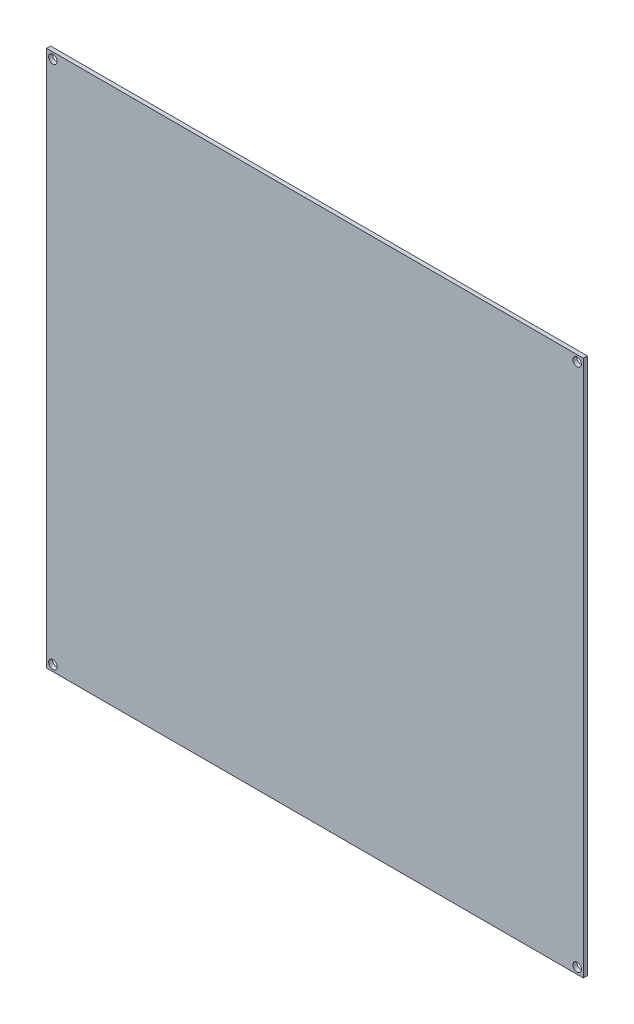
ISO-10303-21;
HEADER;
FILE_DESCRIPTION(('STEP AP214'),'2;1');
FILE_NAME('part.step','',(''),(''),'','','');
FILE_SCHEMA(('AUTOMOTIVE_DESIGN { 1 0 10303 214 1 1 1 1 }'));
ENDSEC;
DATA;
#1=APPLICATION_CONTEXT('core data for automotive mechanical design processes');
#2=APPLICATION_PROTOCOL_DEFINITION('international standard','automotive_design',2000,#1);
#3=PRODUCT_CONTEXT('',#1,'mechanical');
#4=PRODUCT('Part','Part','',(#3));
#5=PRODUCT_RELATED_PRODUCT_CATEGORY('part','',(#4));
#6=PRODUCT_DEFINITION_FORMATION('','',#4);
#7=PRODUCT_DEFINITION_CONTEXT('part definition',#1,'design');
#8=PRODUCT_DEFINITION('design','',#6,#7);
#9=PRODUCT_DEFINITION_SHAPE('','',#8);
#10=(LENGTH_UNIT() NAMED_UNIT(*) SI_UNIT(.MILLI.,.METRE.));
#11=(NAMED_UNIT(*) PLANE_ANGLE_UNIT() SI_UNIT($,.RADIAN.));
#12=(NAMED_UNIT(*) SI_UNIT($,.STERADIAN.) SOLID_ANGLE_UNIT());
#13=UNCERTAINTY_MEASURE_WITH_UNIT(LENGTH_MEASURE(1.E-05),#10,'distance_accuracy_value','');
#14=(GEOMETRIC_REPRESENTATION_CONTEXT(3) GLOBAL_UNCERTAINTY_ASSIGNED_CONTEXT((#13)) GLOBAL_UNIT_ASSIGNED_CONTEXT((#10,
#11,#12)) REPRESENTATION_CONTEXT('',''));
#15=CARTESIAN_POINT('',(0.,0.,0.));
#16=DIRECTION('',(0.,0.,1.));
#17=DIRECTION('',(1.,0.,0.));
#18=AXIS2_PLACEMENT_3D('',#15,#16,#17);
#19=CARTESIAN_POINT('',(-57.,11.,0.800000011920929));
#20=DIRECTION('',(-1.,0.,0.));
#21=DIRECTION('',(0.,0.,1.));
#22=AXIS2_PLACEMENT_3D('',#19,#20,#21);
#23=PLANE('',#22);
#24=DIRECTION('',(0.,1.,0.));
#25=VECTOR('',#24,1.);
#26=CARTESIAN_POINT('',(-57.,11.,-0.800000011920929));
#27=LINE('',#26,#25);
#28=CARTESIAN_POINT('',(-57.,11.,-0.800000011920929));
#29=VERTEX_POINT('',#28);
#30=CARTESIAN_POINT('',(-57.,225.,-0.800000011920929));
#31=VERTEX_POINT('',#30);
#32=EDGE_CURVE('E99',#29,#31,#27,.T.);
#33=ORIENTED_EDGE('',*,*,#32,.F.);
#34=DIRECTION('',(0.,0.,-1.));
#35=VECTOR('',#34,1.);
#36=CARTESIAN_POINT('',(-57.,11.,0.800000011920929));
#37=LINE('',#36,#35);
#38=CARTESIAN_POINT('',(-57.,11.,0.800000011920929));
#39=VERTEX_POINT('',#38);
#40=EDGE_CURVE('E11',#39,#29,#37,.T.);
#41=ORIENTED_EDGE('',*,*,#40,.F.);
#42=DIRECTION('',(0.,1.,0.));
#43=VECTOR('',#42,1.);
#44=CARTESIAN_POINT('',(-57.,11.,0.800000011920929));
#45=LINE('',#44,#43);
#46=CARTESIAN_POINT('',(-57.,225.,0.800000011920929));
#47=VERTEX_POINT('',#46);
#48=EDGE_CURVE('E92',#39,#47,#45,.T.);
#49=ORIENTED_EDGE('',*,*,#48,.T.);
#50=DIRECTION('',(0.,0.,-1.));
#51=VECTOR('',#50,1.);
#52=CARTESIAN_POINT('',(-57.,225.,0.800000011920929));
#53=LINE('',#52,#51);
#54=EDGE_CURVE('E37',#47,#31,#53,.T.);
#55=ORIENTED_EDGE('',*,*,#54,.T.);
#56=EDGE_LOOP('',(#33,#41,#49,#55));
#57=FACE_BOUND('',#56,.T.);
#58=ADVANCED_FACE('F34',(#57),#23,.T.);
#59=CARTESIAN_POINT('',(157.,11.,0.800000011920929));
#60=DIRECTION('',(0.,-1.,0.));
#61=DIRECTION('',(0.,0.,-1.));
#62=AXIS2_PLACEMENT_3D('',#59,#60,#61);
#63=PLANE('',#62);
#64=DIRECTION('',(-1.,0.,0.));
#65=VECTOR('',#64,1.);
#66=CARTESIAN_POINT('',(157.,11.,-0.800000011920929));
#67=LINE('',#66,#65);
#68=CARTESIAN_POINT('',(157.,11.,-0.800000011920929));
#69=VERTEX_POINT('',#68);
#70=EDGE_CURVE('E94',#69,#29,#67,.T.);
#71=ORIENTED_EDGE('',*,*,#70,.F.);
#72=DIRECTION('',(0.,0.,-1.));
#73=VECTOR('',#72,1.);
#74=CARTESIAN_POINT('',(157.,11.,0.800000011920929));
#75=LINE('',#74,#73);
#76=CARTESIAN_POINT('',(157.,11.,0.800000011920929));
#77=VERTEX_POINT('',#76);
#78=EDGE_CURVE('E43',#77,#69,#75,.T.);
#79=ORIENTED_EDGE('',*,*,#78,.F.);
#80=DIRECTION('',(-1.,0.,0.));
#81=VECTOR('',#80,1.);
#82=CARTESIAN_POINT('',(157.,11.,0.800000011920929));
#83=LINE('',#82,#81);
#84=EDGE_CURVE('E89',#77,#39,#83,.T.);
#85=ORIENTED_EDGE('',*,*,#84,.T.);
#86=ORIENTED_EDGE('',*,*,#40,.T.);
#87=EDGE_LOOP('',(#71,#79,#85,#86));
#88=FACE_BOUND('',#87,.T.);
#89=ADVANCED_FACE('F110',(#88),#63,.T.);
#90=CARTESIAN_POINT('',(157.,225.,0.800000011920929));
#91=DIRECTION('',(1.,0.,0.));
#92=DIRECTION('',(0.,1.,0.));
#93=AXIS2_PLACEMENT_3D('',#90,#91,#92);
#94=PLANE('',#93);
#95=DIRECTION('',(0.,-1.,0.));
#96=VECTOR('',#95,1.);
#97=CARTESIAN_POINT('',(157.,225.,-0.800000011920929));
#98=LINE('',#97,#96);
#99=CARTESIAN_POINT('',(157.,225.,-0.800000011920929));
#100=VERTEX_POINT('',#99);
#101=EDGE_CURVE('E84',#100,#69,#98,.T.);
#102=ORIENTED_EDGE('',*,*,#101,.F.);
#103=DIRECTION('',(0.,0.,-1.));
#104=VECTOR('',#103,1.);
#105=CARTESIAN_POINT('',(157.,225.,0.800000011920929));
#106=LINE('',#105,#104);
#107=CARTESIAN_POINT('',(157.,225.,0.800000011920929));
#108=VERTEX_POINT('',#107);
#109=EDGE_CURVE('E79',#108,#100,#106,.T.);
#110=ORIENTED_EDGE('',*,*,#109,.F.);
#111=DIRECTION('',(0.,-1.,0.));
#112=VECTOR('',#111,1.);
#113=CARTESIAN_POINT('',(157.,225.,0.800000011920929));
#114=LINE('',#113,#112);
#115=EDGE_CURVE('E82',#108,#77,#114,.T.);
#116=ORIENTED_EDGE('',*,*,#115,.T.);
#117=ORIENTED_EDGE('',*,*,#78,.T.);
#118=EDGE_LOOP('',(#102,#110,#116,#117));
#119=FACE_BOUND('',#118,.T.);
#120=ADVANCED_FACE('F81',(#119),#94,.T.);
#121=CARTESIAN_POINT('',(-57.,225.,0.800000011920929));
#122=DIRECTION('',(0.,1.,0.));
#123=DIRECTION('',(0.,0.,1.));
#124=AXIS2_PLACEMENT_3D('',#121,#122,#123);
#125=PLANE('',#124);
#126=DIRECTION('',(1.,0.,0.));
#127=VECTOR('',#126,1.);
#128=CARTESIAN_POINT('',(-57.,225.,-0.800000011920929));
#129=LINE('',#128,#127);
#130=EDGE_CURVE('E102',#31,#100,#129,.T.);
#131=ORIENTED_EDGE('',*,*,#130,.F.);
#132=ORIENTED_EDGE('',*,*,#54,.F.);
#133=DIRECTION('',(1.,0.,0.));
#134=VECTOR('',#133,1.);
#135=CARTESIAN_POINT('',(-57.,225.,0.800000011920929));
#136=LINE('',#135,#134);
#137=EDGE_CURVE('E88',#47,#108,#136,.T.);
#138=ORIENTED_EDGE('',*,*,#137,.T.);
#139=ORIENTED_EDGE('',*,*,#109,.T.);
#140=EDGE_LOOP('',(#131,#132,#138,#139));
#141=FACE_BOUND('',#140,.T.);
#142=ADVANCED_FACE('F91',(#141),#125,.T.);
#143=CARTESIAN_POINT('',(0.,0.,0.800000011920929));
#144=DIRECTION('',(0.,0.,-1.));
#145=DIRECTION('',(-1.,0.,0.));
#146=AXIS2_PLACEMENT_3D('',#143,#144,#145);
#147=PLANE('',#146);
#148=CARTESIAN_POINT('',(154.500001332953,222.5,0.800000011920929));
#149=DIRECTION('',(0.,0.,1.));
#150=DIRECTION('',(1.,0.,0.));
#151=AXIS2_PLACEMENT_3D('',#148,#149,#150);
#152=CIRCLE('',#151,1.70000000000001);
#153=CARTESIAN_POINT('',(156.200001332953,222.5,0.800000011920929));
#154=VERTEX_POINT('',#153);
#155=EDGE_CURVE('E154',#154,#154,#152,.T.);
#156=ORIENTED_EDGE('',*,*,#155,.F.);
#157=EDGE_LOOP('',(#156));
#158=FACE_BOUND('',#157,.T.);
#159=CARTESIAN_POINT('',(-54.4999986670466,222.5,0.800000011920929));
#160=DIRECTION('',(0.,0.,1.));
#161=DIRECTION('',(1.,0.,0.));
#162=AXIS2_PLACEMENT_3D('',#159,#160,#161);
#163=CIRCLE('',#162,1.7);
#164=CARTESIAN_POINT('',(-52.7999986670466,222.5,0.800000011920929));
#165=VERTEX_POINT('',#164);
#166=EDGE_CURVE('E156',#165,#165,#163,.T.);
#167=ORIENTED_EDGE('',*,*,#166,.F.);
#168=EDGE_LOOP('',(#167));
#169=FACE_BOUND('',#168,.T.);
#170=CARTESIAN_POINT('',(154.500001332953,13.5,0.800000011920929));
#171=DIRECTION('',(0.,0.,1.));
#172=DIRECTION('',(1.,0.,0.));
#173=AXIS2_PLACEMENT_3D('',#170,#171,#172);
#174=CIRCLE('',#173,1.70000000000001);
#175=CARTESIAN_POINT('',(156.200001332953,13.5,0.800000011920929));
#176=VERTEX_POINT('',#175);
#177=EDGE_CURVE('E162',#176,#176,#174,.T.);
#178=ORIENTED_EDGE('',*,*,#177,.F.);
#179=EDGE_LOOP('',(#178));
#180=FACE_BOUND('',#179,.T.);
#181=CARTESIAN_POINT('',(-54.4999986670466,13.5,0.800000011920929));
#182=DIRECTION('',(0.,0.,1.));
#183=DIRECTION('',(1.,0.,0.));
#184=AXIS2_PLACEMENT_3D('',#181,#182,#183);
#185=CIRCLE('',#184,1.7);
#186=CARTESIAN_POINT('',(-52.7999986670466,13.5,0.800000011920929));
#187=VERTEX_POINT('',#186);
#188=EDGE_CURVE('E168',#187,#187,#185,.T.);
#189=ORIENTED_EDGE('',*,*,#188,.F.);
#190=EDGE_LOOP('',(#189));
#191=FACE_BOUND('',#190,.T.);
#192=ORIENTED_EDGE('',*,*,#48,.F.);
#193=ORIENTED_EDGE('',*,*,#84,.F.);
#194=ORIENTED_EDGE('',*,*,#115,.F.);
#195=ORIENTED_EDGE('',*,*,#137,.F.);
#196=EDGE_LOOP('',(#192,#193,#194,#195));
#197=FACE_BOUND('',#196,.T.);
#198=ADVANCED_FACE('F87',(#158,#169,#180,#191,#197),#147,.F.);
#199=CARTESIAN_POINT('',(0.,0.,-0.800000011920929));
#200=DIRECTION('',(0.,0.,-1.));
#201=DIRECTION('',(-1.,0.,0.));
#202=AXIS2_PLACEMENT_3D('',#199,#200,#201);
#203=PLANE('',#202);
#204=CARTESIAN_POINT('',(154.500001332953,222.5,-0.800000011920929));
#205=DIRECTION('',(0.,0.,1.));
#206=DIRECTION('',(1.,0.,0.));
#207=AXIS2_PLACEMENT_3D('',#204,#205,#206);
#208=CIRCLE('',#207,1.70000000000001);
#209=CARTESIAN_POINT('',(156.200001332953,222.5,-0.800000011920929));
#210=VERTEX_POINT('',#209);
#211=EDGE_CURVE('E152',#210,#210,#208,.T.);
#212=ORIENTED_EDGE('',*,*,#211,.T.);
#213=EDGE_LOOP('',(#212));
#214=FACE_BOUND('',#213,.T.);
#215=CARTESIAN_POINT('',(-54.4999986670466,222.5,-0.800000011920929));
#216=DIRECTION('',(0.,0.,1.));
#217=DIRECTION('',(1.,0.,0.));
#218=AXIS2_PLACEMENT_3D('',#215,#216,#217);
#219=CIRCLE('',#218,1.7);
#220=CARTESIAN_POINT('',(-52.7999986670466,222.5,-0.800000011920929));
#221=VERTEX_POINT('',#220);
#222=EDGE_CURVE('E159',#221,#221,#219,.T.);
#223=ORIENTED_EDGE('',*,*,#222,.T.);
#224=EDGE_LOOP('',(#223));
#225=FACE_BOUND('',#224,.T.);
#226=CARTESIAN_POINT('',(154.500001332953,13.5,-0.800000011920929));
#227=DIRECTION('',(0.,0.,1.));
#228=DIRECTION('',(1.,0.,0.));
#229=AXIS2_PLACEMENT_3D('',#226,#227,#228);
#230=CIRCLE('',#229,1.70000000000001);
#231=CARTESIAN_POINT('',(156.200001332953,13.5,-0.800000011920929));
#232=VERTEX_POINT('',#231);
#233=EDGE_CURVE('E165',#232,#232,#230,.T.);
#234=ORIENTED_EDGE('',*,*,#233,.T.);
#235=EDGE_LOOP('',(#234));
#236=FACE_BOUND('',#235,.T.);
#237=CARTESIAN_POINT('',(-54.4999986670466,13.5,-0.800000011920929));
#238=DIRECTION('',(0.,0.,1.));
#239=DIRECTION('',(1.,0.,0.));
#240=AXIS2_PLACEMENT_3D('',#237,#238,#239);
#241=CIRCLE('',#240,1.7);
#242=CARTESIAN_POINT('',(-52.7999986670466,13.5,-0.800000011920929));
#243=VERTEX_POINT('',#242);
#244=EDGE_CURVE('E103',#243,#243,#241,.T.);
#245=ORIENTED_EDGE('',*,*,#244,.T.);
#246=EDGE_LOOP('',(#245));
#247=FACE_BOUND('',#246,.T.);
#248=ORIENTED_EDGE('',*,*,#32,.T.);
#249=ORIENTED_EDGE('',*,*,#130,.T.);
#250=ORIENTED_EDGE('',*,*,#101,.T.);
#251=ORIENTED_EDGE('',*,*,#70,.T.);
#252=EDGE_LOOP('',(#248,#249,#250,#251));
#253=FACE_BOUND('',#252,.T.);
#254=ADVANCED_FACE('F109',(#214,#225,#236,#247,#253),#203,.T.);
#255=CARTESIAN_POINT('',(-54.4999986670466,13.5,-0.800000011920929));
#256=DIRECTION('',(0.,0.,1.));
#257=DIRECTION('',(1.,0.,0.));
#258=AXIS2_PLACEMENT_3D('',#255,#256,#257);
#259=CYLINDRICAL_SURFACE('',#258,1.7);
#260=ORIENTED_EDGE('',*,*,#244,.F.);
#261=EDGE_LOOP('',(#260));
#262=FACE_BOUND('',#261,.T.);
#263=ORIENTED_EDGE('',*,*,#188,.T.);
#264=EDGE_LOOP('',(#263));
#265=FACE_BOUND('',#264,.T.);
#266=ADVANCED_FACE('F128',(#262,#265),#259,.F.);
#267=CARTESIAN_POINT('',(154.500001332953,13.5,-0.800000011920929));
#268=DIRECTION('',(0.,0.,1.));
#269=DIRECTION('',(1.,0.,0.));
#270=AXIS2_PLACEMENT_3D('',#267,#268,#269);
#271=CYLINDRICAL_SURFACE('',#270,1.70000000000001);
#272=ORIENTED_EDGE('',*,*,#233,.F.);
#273=EDGE_LOOP('',(#272));
#274=FACE_BOUND('',#273,.T.);
#275=ORIENTED_EDGE('',*,*,#177,.T.);
#276=EDGE_LOOP('',(#275));
#277=FACE_BOUND('',#276,.T.);
#278=ADVANCED_FACE('F135',(#274,#277),#271,.F.);
#279=CARTESIAN_POINT('',(-54.4999986670466,222.5,-0.800000011920929));
#280=DIRECTION('',(0.,0.,1.));
#281=DIRECTION('',(1.,0.,0.));
#282=AXIS2_PLACEMENT_3D('',#279,#280,#281);
#283=CYLINDRICAL_SURFACE('',#282,1.7);
#284=ORIENTED_EDGE('',*,*,#222,.F.);
#285=EDGE_LOOP('',(#284));
#286=FACE_BOUND('',#285,.T.);
#287=ORIENTED_EDGE('',*,*,#166,.T.);
#288=EDGE_LOOP('',(#287));
#289=FACE_BOUND('',#288,.T.);
#290=ADVANCED_FACE('F139',(#286,#289),#283,.F.);
#291=CARTESIAN_POINT('',(154.500001332953,222.5,-0.800000011920929));
#292=DIRECTION('',(0.,0.,1.));
#293=DIRECTION('',(1.,0.,0.));
#294=AXIS2_PLACEMENT_3D('',#291,#292,#293);
#295=CYLINDRICAL_SURFACE('',#294,1.70000000000001);
#296=ORIENTED_EDGE('',*,*,#211,.F.);
#297=EDGE_LOOP('',(#296));
#298=FACE_BOUND('',#297,.T.);
#299=ORIENTED_EDGE('',*,*,#155,.T.);
#300=EDGE_LOOP('',(#299));
#301=FACE_BOUND('',#300,.T.);
#302=ADVANCED_FACE('F143',(#298,#301),#295,.F.);
#303=CLOSED_SHELL('',(#58,#89,#120,#142,#198,#254,#266,#278,#290,#302));
#304=MANIFOLD_SOLID_BREP('B2',#303);
#305=ADVANCED_BREP_SHAPE_REPRESENTATION('',(#18,#304),#14);
#306=SHAPE_DEFINITION_REPRESENTATION(#9,#305);
ENDSEC;
END-ISO-10303-21;
